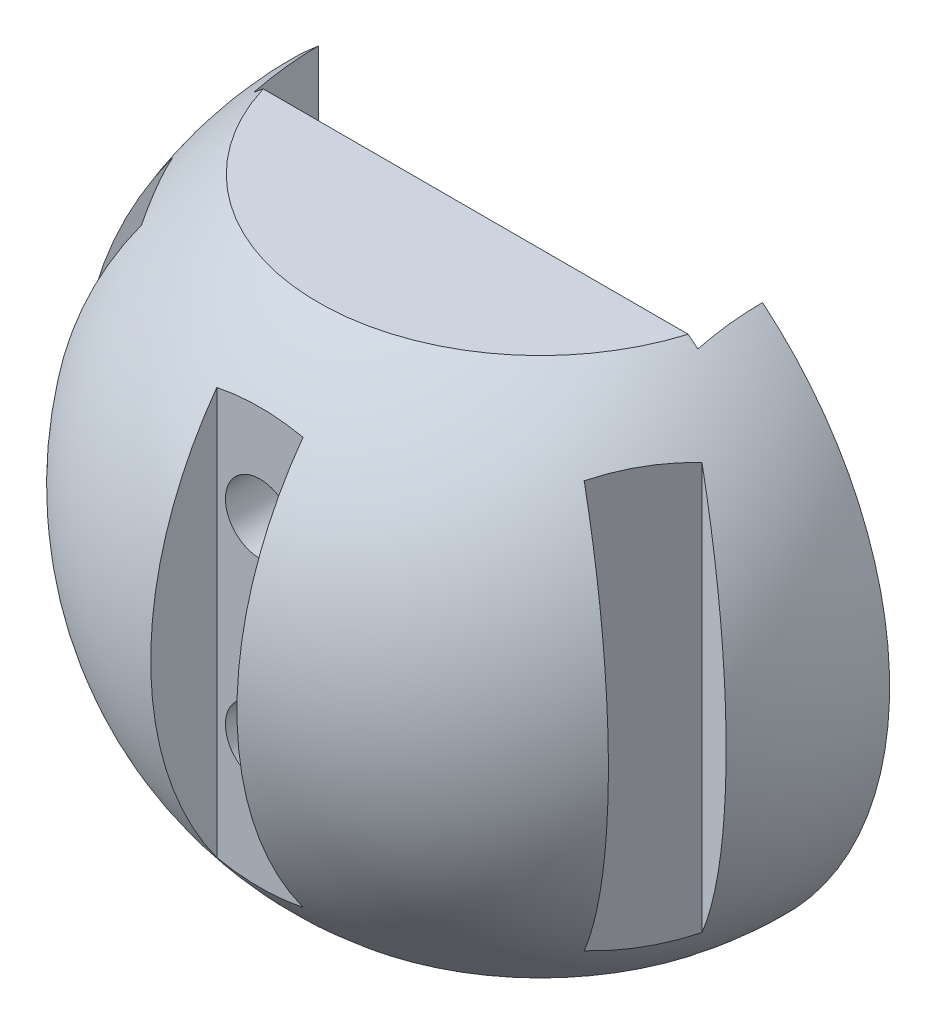
ISO-10303-21;
HEADER;
FILE_DESCRIPTION(('STEP AP214'),'2;1');
FILE_NAME('part.step','',(''),(''),'','','');
FILE_SCHEMA(('AUTOMOTIVE_DESIGN { 1 0 10303 214 1 1 1 1 }'));
ENDSEC;
DATA;
#1=APPLICATION_CONTEXT('core data for automotive mechanical design processes');
#2=APPLICATION_PROTOCOL_DEFINITION('international standard','automotive_design',2000,#1);
#3=PRODUCT_CONTEXT('',#1,'mechanical');
#4=PRODUCT('Part','Part','',(#3));
#5=PRODUCT_RELATED_PRODUCT_CATEGORY('part','',(#4));
#6=PRODUCT_DEFINITION_FORMATION('','',#4);
#7=PRODUCT_DEFINITION_CONTEXT('part definition',#1,'design');
#8=PRODUCT_DEFINITION('design','',#6,#7);
#9=PRODUCT_DEFINITION_SHAPE('','',#8);
#10=(LENGTH_UNIT() NAMED_UNIT(*) SI_UNIT(.MILLI.,.METRE.));
#11=(NAMED_UNIT(*) PLANE_ANGLE_UNIT() SI_UNIT($,.RADIAN.));
#12=(NAMED_UNIT(*) SI_UNIT($,.STERADIAN.) SOLID_ANGLE_UNIT());
#13=UNCERTAINTY_MEASURE_WITH_UNIT(LENGTH_MEASURE(1.E-05),#10,'distance_accuracy_value','');
#14=(GEOMETRIC_REPRESENTATION_CONTEXT(3) GLOBAL_UNCERTAINTY_ASSIGNED_CONTEXT((#13)) GLOBAL_UNIT_ASSIGNED_CONTEXT((#10,
#11,#12)) REPRESENTATION_CONTEXT('',''));
#15=CARTESIAN_POINT('',(0.,0.,0.));
#16=DIRECTION('',(0.,0.,1.));
#17=DIRECTION('',(1.,0.,0.));
#18=AXIS2_PLACEMENT_3D('',#15,#16,#17);
#19=CARTESIAN_POINT('',(0.,8.1,0.));
#20=DIRECTION('',(0.,1.,0.));
#21=DIRECTION('',(-1.,0.,0.));
#22=AXIS2_PLACEMENT_3D('',#19,#20,#21);
#23=SPHERICAL_SURFACE('',#22,16.2);
#24=CARTESIAN_POINT('',(-0.999999999999992,8.1,1.73205080756888));
#25=DIRECTION('',(0.499999999999998,0.,-0.86602540378444));
#26=DIRECTION('',(-0.86602540378444,0.,-0.499999999999998));
#27=AXIS2_PLACEMENT_3D('',#24,#25,#26);
#28=CIRCLE('',#27,16.0760691712869);
#29=CARTESIAN_POINT('',(10.2682706123791,17.5414742779712,8.23778987892746));
#30=VERTEX_POINT('',#29);
#31=CARTESIAN_POINT('',(10.2682706123791,-1.34147427797122,8.23778987892746));
#32=VERTEX_POINT('',#31);
#33=EDGE_CURVE('E138',#30,#32,#28,.T.);
#34=ORIENTED_EDGE('',*,*,#33,.F.);
#35=CARTESIAN_POINT('',(11.2682706123791,8.1,6.50573907135858));
#36=DIRECTION('',(-0.86602540378444,0.,-0.499999999999998));
#37=DIRECTION('',(-0.499999999999998,0.,0.86602540378444));
#38=AXIS2_PLACEMENT_3D('',#35,#36,#37);
#39=CIRCLE('',#38,9.65098111808287);
#40=CARTESIAN_POINT('',(12.2682706123791,17.5414742779712,4.7736882637897));
#41=VERTEX_POINT('',#40);
#42=EDGE_CURVE('E131',#30,#41,#39,.T.);
#43=ORIENTED_EDGE('',*,*,#42,.T.);
#44=CARTESIAN_POINT('',(1.,8.1,-1.73205080756888));
#45=DIRECTION('',(0.499999999999998,0.,-0.86602540378444));
#46=DIRECTION('',(-0.86602540378444,0.,-0.499999999999998));
#47=AXIS2_PLACEMENT_3D('',#44,#45,#46);
#48=CIRCLE('',#47,16.0760691712869);
#49=CARTESIAN_POINT('',(12.2682706123791,-1.34147427797122,4.7736882637897));
#50=VERTEX_POINT('',#49);
#51=EDGE_CURVE('E120',#41,#50,#48,.T.);
#52=ORIENTED_EDGE('',*,*,#51,.T.);
#53=EDGE_CURVE('E125',#50,#32,#39,.T.);
#54=ORIENTED_EDGE('',*,*,#53,.T.);
#55=EDGE_LOOP('',(#34,#43,#52,#54));
#56=FACE_BOUND('',#55,.T.);
#57=CARTESIAN_POINT('',(0.,8.1,3.));
#58=DIRECTION('',(0.,0.,1.));
#59=DIRECTION('',(1.,0.,0.));
#60=AXIS2_PLACEMENT_3D('',#57,#58,#59);
#61=CIRCLE('',#60,15.9197989937059);
#62=CARTESIAN_POINT('',(-9.85684605063265,20.6013033694142,2.99999999999993));
#63=VERTEX_POINT('',#62);
#64=CARTESIAN_POINT('',(-10.3032720077591,20.2360037052618,2.99999999999993));
#65=VERTEX_POINT('',#64);
#66=EDGE_CURVE('E185',#63,#65,#61,.T.);
#67=ORIENTED_EDGE('',*,*,#66,.T.);
#68=CARTESIAN_POINT('',(-10.3032720077591,8.1,0.));
#69=DIRECTION('',(-1.,0.,0.));
#70=DIRECTION('',(0.,0.,1.));
#71=AXIS2_PLACEMENT_3D('',#68,#69,#70);
#72=CIRCLE('',#71,12.5013033694142);
#73=CARTESIAN_POINT('',(-10.3032720077591,20.6013033694142,0.));
#74=VERTEX_POINT('',#73);
#75=EDGE_CURVE('E189',#65,#74,#72,.T.);
#76=ORIENTED_EDGE('',*,*,#75,.T.);
#77=CARTESIAN_POINT('',(0.,8.1,0.));
#78=DIRECTION('',(0.,0.,-1.));
#79=DIRECTION('',(1.,0.,0.));
#80=AXIS2_PLACEMENT_3D('',#77,#78,#79);
#81=CIRCLE('',#80,16.2);
#82=CARTESIAN_POINT('',(-10.3032720077591,-4.40130336941424,0.));
#83=VERTEX_POINT('',#82);
#84=EDGE_CURVE('E203',#83,#74,#81,.T.);
#85=ORIENTED_EDGE('',*,*,#84,.F.);
#86=CARTESIAN_POINT('',(-10.3032720077591,-4.03600370526179,2.99999999999993));
#87=VERTEX_POINT('',#86);
#88=EDGE_CURVE('E186',#83,#87,#72,.T.);
#89=ORIENTED_EDGE('',*,*,#88,.T.);
#90=CARTESIAN_POINT('',(-9.85684605063265,-4.40130336941424,2.99999999999993));
#91=VERTEX_POINT('',#90);
#92=EDGE_CURVE('E280',#87,#91,#61,.T.);
#93=ORIENTED_EDGE('',*,*,#92,.T.);
#94=CARTESIAN_POINT('',(0.,-4.40130336941424,0.));
#95=DIRECTION('',(0.,1.,0.));
#96=DIRECTION('',(0.,0.,1.));
#97=AXIS2_PLACEMENT_3D('',#94,#95,#96);
#98=CIRCLE('',#97,10.3032720077591);
#99=CARTESIAN_POINT('',(9.85684605063262,-4.40130336941424,3.00000000000007));
#100=VERTEX_POINT('',#99);
#101=EDGE_CURVE('E194',#91,#100,#98,.T.);
#102=ORIENTED_EDGE('',*,*,#101,.T.);
#103=CARTESIAN_POINT('',(10.3032720077591,-4.03600370526179,3.00000000000007));
#104=VERTEX_POINT('',#103);
#105=EDGE_CURVE('E179',#100,#104,#61,.T.);
#106=ORIENTED_EDGE('',*,*,#105,.T.);
#107=CARTESIAN_POINT('',(10.3032720077591,8.1,0.));
#108=DIRECTION('',(1.,0.,0.));
#109=DIRECTION('',(0.,0.,-1.));
#110=AXIS2_PLACEMENT_3D('',#107,#108,#109);
#111=CIRCLE('',#110,12.5013033694142);
#112=CARTESIAN_POINT('',(10.3032720077591,-4.40130336941424,0.));
#113=VERTEX_POINT('',#112);
#114=EDGE_CURVE('E190',#104,#113,#111,.T.);
#115=ORIENTED_EDGE('',*,*,#114,.T.);
#116=CARTESIAN_POINT('',(10.3032720077591,20.6013033694142,0.));
#117=VERTEX_POINT('',#116);
#118=EDGE_CURVE('E200',#117,#113,#81,.T.);
#119=ORIENTED_EDGE('',*,*,#118,.F.);
#120=CARTESIAN_POINT('',(10.3032720077591,20.2360037052618,3.00000000000007));
#121=VERTEX_POINT('',#120);
#122=EDGE_CURVE('E193',#117,#121,#111,.T.);
#123=ORIENTED_EDGE('',*,*,#122,.T.);
#124=CARTESIAN_POINT('',(9.85684605063261,20.6013033694142,3.00000000000007));
#125=VERTEX_POINT('',#124);
#126=EDGE_CURVE('E184',#121,#125,#61,.T.);
#127=ORIENTED_EDGE('',*,*,#126,.T.);
#128=CARTESIAN_POINT('',(0.,20.6013033694142,0.));
#129=DIRECTION('',(0.,-1.,0.));
#130=DIRECTION('',(0.,0.,-1.));
#131=AXIS2_PLACEMENT_3D('',#128,#129,#130);
#132=CIRCLE('',#131,10.3032720077591);
#133=EDGE_CURVE('E197',#125,#63,#132,.T.);
#134=ORIENTED_EDGE('',*,*,#133,.T.);
#135=EDGE_LOOP('',(#67,#76,#85,#89,#93,#102,#106,#115,#119,#123,#127,#134));
#136=FACE_BOUND('',#135,.T.);
#137=CARTESIAN_POINT('',(-2.,8.1,0.));
#138=DIRECTION('',(1.,0.,0.));
#139=DIRECTION('',(0.,0.,-1.));
#140=AXIS2_PLACEMENT_3D('',#137,#138,#139);
#141=CIRCLE('',#140,16.0760691712869);
#142=CARTESIAN_POINT('',(-2.,17.5414742779712,13.0114781427172));
#143=VERTEX_POINT('',#142);
#144=CARTESIAN_POINT('',(-2.,-1.34147427797122,13.0114781427172));
#145=VERTEX_POINT('',#144);
#146=EDGE_CURVE('E126',#143,#145,#141,.T.);
#147=ORIENTED_EDGE('',*,*,#146,.F.);
#148=CARTESIAN_POINT('',(0.,8.1,13.0114781427172));
#149=DIRECTION('',(0.,0.,-1.));
#150=DIRECTION('',(-1.,0.,0.));
#151=AXIS2_PLACEMENT_3D('',#148,#149,#150);
#152=CIRCLE('',#151,9.65098111808287);
#153=CARTESIAN_POINT('',(2.,17.5414742779712,13.0114781427172));
#154=VERTEX_POINT('',#153);
#155=EDGE_CURVE('E212',#143,#154,#152,.T.);
#156=ORIENTED_EDGE('',*,*,#155,.T.);
#157=CARTESIAN_POINT('',(2.,8.1,0.));
#158=DIRECTION('',(1.,0.,0.));
#159=DIRECTION('',(0.,0.,-1.));
#160=AXIS2_PLACEMENT_3D('',#157,#158,#159);
#161=CIRCLE('',#160,16.0760691712869);
#162=CARTESIAN_POINT('',(2.,-1.34147427797122,13.0114781427172));
#163=VERTEX_POINT('',#162);
#164=EDGE_CURVE('E207',#154,#163,#161,.T.);
#165=ORIENTED_EDGE('',*,*,#164,.T.);
#166=EDGE_CURVE('E210',#163,#145,#152,.T.);
#167=ORIENTED_EDGE('',*,*,#166,.T.);
#168=EDGE_LOOP('',(#147,#156,#165,#167));
#169=FACE_BOUND('',#168,.T.);
#170=CARTESIAN_POINT('',(-1.00000000000002,8.1,-1.73205080756887));
#171=DIRECTION('',(0.50000000000001,0.,0.866025403784433));
#172=DIRECTION('',(0.866025403784433,0.,-0.50000000000001));
#173=AXIS2_PLACEMENT_3D('',#170,#171,#172);
#174=CIRCLE('',#173,16.0760691712869);
#175=CARTESIAN_POINT('',(-12.268270612379,17.5414742779712,4.77368826378988));
#176=VERTEX_POINT('',#175);
#177=CARTESIAN_POINT('',(-12.268270612379,-1.34147427797121,4.77368826378988));
#178=VERTEX_POINT('',#177);
#179=EDGE_CURVE('E11',#176,#178,#174,.T.);
#180=ORIENTED_EDGE('',*,*,#179,.F.);
#181=CARTESIAN_POINT('',(-11.268270612379,8.1,6.50573907135874));
#182=DIRECTION('',(0.866025403784433,0.,-0.50000000000001));
#183=DIRECTION('',(-0.50000000000001,0.,-0.866025403784433));
#184=AXIS2_PLACEMENT_3D('',#181,#182,#183);
#185=CIRCLE('',#184,9.65098111808286);
#186=CARTESIAN_POINT('',(-10.268270612379,17.5414742779712,8.23778987892761));
#187=VERTEX_POINT('',#186);
#188=EDGE_CURVE('E42',#176,#187,#185,.T.);
#189=ORIENTED_EDGE('',*,*,#188,.T.);
#190=CARTESIAN_POINT('',(1.00000000000002,8.1,1.73205080756886));
#191=DIRECTION('',(0.50000000000001,0.,0.866025403784433));
#192=DIRECTION('',(0.866025403784433,0.,-0.50000000000001));
#193=AXIS2_PLACEMENT_3D('',#190,#191,#192);
#194=CIRCLE('',#193,16.0760691712869);
#195=CARTESIAN_POINT('',(-10.268270612379,-1.34147427797121,8.23778987892761));
#196=VERTEX_POINT('',#195);
#197=EDGE_CURVE('E140',#187,#196,#194,.T.);
#198=ORIENTED_EDGE('',*,*,#197,.T.);
#199=EDGE_CURVE('E145',#196,#178,#185,.T.);
#200=ORIENTED_EDGE('',*,*,#199,.T.);
#201=EDGE_LOOP('',(#180,#189,#198,#200));
#202=FACE_BOUND('',#201,.T.);
#203=ADVANCED_FACE('F35',(#56,#136,#169,#202),#23,.T.);
#204=CARTESIAN_POINT('',(0.,8.1,0.));
#205=DIRECTION('',(0.,0.,1.));
#206=DIRECTION('',(1.,0.,0.));
#207=AXIS2_PLACEMENT_3D('',#204,#205,#206);
#208=PLANE('',#207);
#209=ORIENTED_EDGE('',*,*,#118,.T.);
#210=DIRECTION('',(0.,-1.,0.));
#211=VECTOR('',#210,1.);
#212=CARTESIAN_POINT('',(10.3032720077591,20.6013033694142,0.));
#213=LINE('',#212,#211);
#214=EDGE_CURVE('E167',#117,#113,#213,.T.);
#215=ORIENTED_EDGE('',*,*,#214,.F.);
#216=EDGE_LOOP('',(#209,#215));
#217=FACE_BOUND('',#216,.T.);
#218=ADVANCED_FACE('F236',(#217),#208,.F.);
#219=ORIENTED_EDGE('',*,*,#84,.T.);
#220=DIRECTION('',(0.,1.,0.));
#221=VECTOR('',#220,1.);
#222=CARTESIAN_POINT('',(-10.3032720077591,20.6013033694142,0.));
#223=LINE('',#222,#221);
#224=EDGE_CURVE('E174',#83,#74,#223,.T.);
#225=ORIENTED_EDGE('',*,*,#224,.F.);
#226=EDGE_LOOP('',(#219,#225));
#227=FACE_BOUND('',#226,.T.);
#228=ADVANCED_FACE('F240',(#227),#208,.F.);
#229=CARTESIAN_POINT('',(10.303272007759,-4.40130336941424,16.2000000000002));
#230=DIRECTION('',(0.,1.,0.));
#231=DIRECTION('',(0.,0.,1.));
#232=AXIS2_PLACEMENT_3D('',#229,#230,#231);
#233=PLANE('',#232);
#234=ORIENTED_EDGE('',*,*,#101,.F.);
#235=DIRECTION('',(-1.,0.,0.));
#236=VECTOR('',#235,1.);
#237=CARTESIAN_POINT('',(-10.3032720077591,-4.40130336941424,2.99999999999993));
#238=LINE('',#237,#236);
#239=EDGE_CURVE('E173',#100,#91,#238,.T.);
#240=ORIENTED_EDGE('',*,*,#239,.F.);
#241=EDGE_LOOP('',(#234,#240));
#242=FACE_BOUND('',#241,.T.);
#243=ADVANCED_FACE('F245',(#242),#233,.F.);
#244=CARTESIAN_POINT('',(10.303272007759,20.6013033694142,16.2000000000002));
#245=DIRECTION('',(0.,-1.,0.));
#246=DIRECTION('',(0.,0.,-1.));
#247=AXIS2_PLACEMENT_3D('',#244,#245,#246);
#248=PLANE('',#247);
#249=ORIENTED_EDGE('',*,*,#133,.F.);
#250=DIRECTION('',(-1.,0.,0.));
#251=VECTOR('',#250,1.);
#252=CARTESIAN_POINT('',(10.3032720077591,20.6013033694142,3.00000000000007));
#253=LINE('',#252,#251);
#254=EDGE_CURVE('E204',#125,#63,#253,.T.);
#255=ORIENTED_EDGE('',*,*,#254,.T.);
#256=EDGE_LOOP('',(#249,#255));
#257=FACE_BOUND('',#256,.T.);
#258=ADVANCED_FACE('F250',(#257),#248,.F.);
#259=CARTESIAN_POINT('',(10.3032720077591,20.6013033694142,3.00000000000007));
#260=DIRECTION('',(1.,0.,0.));
#261=DIRECTION('',(0.,0.,-1.));
#262=AXIS2_PLACEMENT_3D('',#259,#260,#261);
#263=PLANE('',#262);
#264=ORIENTED_EDGE('',*,*,#214,.T.);
#265=ORIENTED_EDGE('',*,*,#114,.F.);
#266=DIRECTION('',(0.,-1.,0.));
#267=VECTOR('',#266,1.);
#268=CARTESIAN_POINT('',(10.3032720077591,20.6013033694142,3.00000000000007));
#269=LINE('',#268,#267);
#270=EDGE_CURVE('E170',#121,#104,#269,.T.);
#271=ORIENTED_EDGE('',*,*,#270,.F.);
#272=ORIENTED_EDGE('',*,*,#122,.F.);
#273=EDGE_LOOP('',(#264,#265,#271,#272));
#274=FACE_BOUND('',#273,.T.);
#275=ADVANCED_FACE('F254',(#274),#263,.F.);
#276=CARTESIAN_POINT('',(-10.3032720077591,20.6013033694142,2.99999999999993));
#277=DIRECTION('',(-1.,0.,0.));
#278=DIRECTION('',(0.,0.,1.));
#279=AXIS2_PLACEMENT_3D('',#276,#277,#278);
#280=PLANE('',#279);
#281=DIRECTION('',(0.,1.,0.));
#282=VECTOR('',#281,1.);
#283=CARTESIAN_POINT('',(-10.3032720077591,20.6013033694142,2.99999999999993));
#284=LINE('',#283,#282);
#285=EDGE_CURVE('E176',#87,#65,#284,.T.);
#286=ORIENTED_EDGE('',*,*,#285,.F.);
#287=ORIENTED_EDGE('',*,*,#88,.F.);
#288=ORIENTED_EDGE('',*,*,#224,.T.);
#289=ORIENTED_EDGE('',*,*,#75,.F.);
#290=EDGE_LOOP('',(#286,#287,#288,#289));
#291=FACE_BOUND('',#290,.T.);
#292=ADVANCED_FACE('F258',(#291),#280,.F.);
#293=CARTESIAN_POINT('',(0.,0.,3.));
#294=DIRECTION('',(0.,0.,1.));
#295=DIRECTION('',(1.,0.,0.));
#296=AXIS2_PLACEMENT_3D('',#293,#294,#295);
#297=PLANE('',#296);
#298=CARTESIAN_POINT('',(0.,13.2675786142792,3.));
#299=DIRECTION('',(0.,0.,1.));
#300=DIRECTION('',(1.,0.,0.));
#301=AXIS2_PLACEMENT_3D('',#298,#299,#300);
#302=CIRCLE('',#301,1.6);
#303=CARTESIAN_POINT('',(1.60000000000001,13.2675786142792,3.00000000000001));
#304=VERTEX_POINT('',#303);
#305=EDGE_CURVE('E157',#304,#304,#302,.T.);
#306=ORIENTED_EDGE('',*,*,#305,.T.);
#307=EDGE_LOOP('',(#306));
#308=FACE_BOUND('',#307,.T.);
#309=CARTESIAN_POINT('',(0.,4.21540642099021,3.));
#310=DIRECTION('',(0.,0.,1.));
#311=DIRECTION('',(1.,0.,0.));
#312=AXIS2_PLACEMENT_3D('',#309,#310,#311);
#313=CIRCLE('',#312,1.6);
#314=CARTESIAN_POINT('',(1.60000000000001,4.21540642099021,3.00000000000001));
#315=VERTEX_POINT('',#314);
#316=EDGE_CURVE('E273',#315,#315,#313,.T.);
#317=ORIENTED_EDGE('',*,*,#316,.T.);
#318=EDGE_LOOP('',(#317));
#319=FACE_BOUND('',#318,.T.);
#320=ORIENTED_EDGE('',*,*,#254,.F.);
#321=ORIENTED_EDGE('',*,*,#126,.F.);
#322=ORIENTED_EDGE('',*,*,#270,.T.);
#323=ORIENTED_EDGE('',*,*,#105,.F.);
#324=ORIENTED_EDGE('',*,*,#239,.T.);
#325=ORIENTED_EDGE('',*,*,#92,.F.);
#326=ORIENTED_EDGE('',*,*,#285,.T.);
#327=ORIENTED_EDGE('',*,*,#66,.F.);
#328=EDGE_LOOP('',(#320,#321,#322,#323,#324,#325,#326,#327));
#329=FACE_BOUND('',#328,.T.);
#330=ADVANCED_FACE('F231',(#308,#319,#329),#297,.F.);
#331=CARTESIAN_POINT('',(-2.,20.6013033694142,13.0114781427172));
#332=DIRECTION('',(0.,0.,-1.));
#333=DIRECTION('',(-1.,0.,0.));
#334=AXIS2_PLACEMENT_3D('',#331,#332,#333);
#335=PLANE('',#334);
#336=CARTESIAN_POINT('',(0.,13.2675786142792,13.0114781427172));
#337=DIRECTION('',(0.,0.,1.));
#338=DIRECTION('',(1.,0.,0.));
#339=AXIS2_PLACEMENT_3D('',#336,#337,#338);
#340=CIRCLE('',#339,1.6);
#341=CARTESIAN_POINT('',(1.60000000000001,13.2675786142792,13.0114781427172));
#342=VERTEX_POINT('',#341);
#343=EDGE_CURVE('E291',#342,#342,#340,.T.);
#344=ORIENTED_EDGE('',*,*,#343,.F.);
#345=EDGE_LOOP('',(#344));
#346=FACE_BOUND('',#345,.T.);
#347=CARTESIAN_POINT('',(0.,4.21540642099021,13.0114781427172));
#348=DIRECTION('',(0.,0.,1.));
#349=DIRECTION('',(1.,0.,0.));
#350=AXIS2_PLACEMENT_3D('',#347,#348,#349);
#351=CIRCLE('',#350,1.6);
#352=CARTESIAN_POINT('',(1.60000000000001,4.21540642099021,13.0114781427172));
#353=VERTEX_POINT('',#352);
#354=EDGE_CURVE('E293',#353,#353,#351,.T.);
#355=ORIENTED_EDGE('',*,*,#354,.F.);
#356=EDGE_LOOP('',(#355));
#357=FACE_BOUND('',#356,.T.);
#358=DIRECTION('',(0.,1.,0.));
#359=VECTOR('',#358,1.);
#360=CARTESIAN_POINT('',(-2.,20.6013033694142,13.0114781427172));
#361=LINE('',#360,#359);
#362=EDGE_CURVE('E164',#145,#143,#361,.T.);
#363=ORIENTED_EDGE('',*,*,#362,.F.);
#364=ORIENTED_EDGE('',*,*,#166,.F.);
#365=DIRECTION('',(0.,1.,0.));
#366=VECTOR('',#365,1.);
#367=CARTESIAN_POINT('',(2.,20.6013033694142,13.0114781427172));
#368=LINE('',#367,#366);
#369=EDGE_CURVE('E162',#163,#154,#368,.T.);
#370=ORIENTED_EDGE('',*,*,#369,.T.);
#371=ORIENTED_EDGE('',*,*,#155,.F.);
#372=EDGE_LOOP('',(#363,#364,#370,#371));
#373=FACE_BOUND('',#372,.T.);
#374=ADVANCED_FACE('F219',(#346,#357,#373),#335,.F.);
#375=CARTESIAN_POINT('',(-2.,0.,0.));
#376=DIRECTION('',(1.,0.,0.));
#377=DIRECTION('',(0.,0.,-1.));
#378=AXIS2_PLACEMENT_3D('',#375,#376,#377);
#379=PLANE('',#378);
#380=ORIENTED_EDGE('',*,*,#146,.T.);
#381=ORIENTED_EDGE('',*,*,#362,.T.);
#382=EDGE_LOOP('',(#380,#381));
#383=FACE_BOUND('',#382,.T.);
#384=ADVANCED_FACE('F221',(#383),#379,.T.);
#385=CARTESIAN_POINT('',(2.,0.,0.));
#386=DIRECTION('',(1.,0.,0.));
#387=DIRECTION('',(0.,0.,-1.));
#388=AXIS2_PLACEMENT_3D('',#385,#386,#387);
#389=PLANE('',#388);
#390=ORIENTED_EDGE('',*,*,#369,.F.);
#391=ORIENTED_EDGE('',*,*,#164,.F.);
#392=EDGE_LOOP('',(#390,#391));
#393=FACE_BOUND('',#392,.T.);
#394=ADVANCED_FACE('F223',(#393),#389,.F.);
#395=CARTESIAN_POINT('',(10.2682706123791,20.6013033694142,8.23778987892746));
#396=DIRECTION('',(-0.86602540378444,0.,-0.499999999999998));
#397=DIRECTION('',(-0.499999999999998,0.,0.86602540378444));
#398=AXIS2_PLACEMENT_3D('',#395,#396,#397);
#399=PLANE('',#398);
#400=DIRECTION('',(0.,1.,0.));
#401=VECTOR('',#400,1.);
#402=CARTESIAN_POINT('',(10.2682706123791,20.6013033694142,8.23778987892746));
#403=LINE('',#402,#401);
#404=EDGE_CURVE('E133',#32,#30,#403,.T.);
#405=ORIENTED_EDGE('',*,*,#404,.F.);
#406=ORIENTED_EDGE('',*,*,#53,.F.);
#407=DIRECTION('',(0.,1.,0.));
#408=VECTOR('',#407,1.);
#409=CARTESIAN_POINT('',(12.2682706123791,20.6013033694142,4.7736882637897));
#410=LINE('',#409,#408);
#411=EDGE_CURVE('E55',#50,#41,#410,.T.);
#412=ORIENTED_EDGE('',*,*,#411,.T.);
#413=ORIENTED_EDGE('',*,*,#42,.F.);
#414=EDGE_LOOP('',(#405,#406,#412,#413));
#415=FACE_BOUND('',#414,.T.);
#416=ADVANCED_FACE('F130',(#415),#399,.F.);
#417=CARTESIAN_POINT('',(-0.999999999999996,0.,1.73205080756888));
#418=DIRECTION('',(0.499999999999998,0.,-0.86602540378444));
#419=DIRECTION('',(-0.86602540378444,0.,-0.499999999999998));
#420=AXIS2_PLACEMENT_3D('',#417,#418,#419);
#421=PLANE('',#420);
#422=ORIENTED_EDGE('',*,*,#33,.T.);
#423=ORIENTED_EDGE('',*,*,#404,.T.);
#424=EDGE_LOOP('',(#422,#423));
#425=FACE_BOUND('',#424,.T.);
#426=ADVANCED_FACE('F317',(#425),#421,.T.);
#427=CARTESIAN_POINT('',(0.999999999999996,0.,-1.73205080756888));
#428=DIRECTION('',(0.499999999999998,0.,-0.86602540378444));
#429=DIRECTION('',(-0.86602540378444,0.,-0.499999999999998));
#430=AXIS2_PLACEMENT_3D('',#427,#428,#429);
#431=PLANE('',#430);
#432=ORIENTED_EDGE('',*,*,#411,.F.);
#433=ORIENTED_EDGE('',*,*,#51,.F.);
#434=EDGE_LOOP('',(#432,#433));
#435=FACE_BOUND('',#434,.T.);
#436=ADVANCED_FACE('F121',(#435),#431,.F.);
#437=CARTESIAN_POINT('',(-12.268270612379,20.6013033694142,4.77368826378988));
#438=DIRECTION('',(0.866025403784433,0.,-0.50000000000001));
#439=DIRECTION('',(-0.50000000000001,0.,-0.866025403784433));
#440=AXIS2_PLACEMENT_3D('',#437,#438,#439);
#441=PLANE('',#440);
#442=DIRECTION('',(0.,1.,0.));
#443=VECTOR('',#442,1.);
#444=CARTESIAN_POINT('',(-12.268270612379,20.6013033694142,4.77368826378988));
#445=LINE('',#444,#443);
#446=EDGE_CURVE('E134',#178,#176,#445,.T.);
#447=ORIENTED_EDGE('',*,*,#446,.F.);
#448=ORIENTED_EDGE('',*,*,#199,.F.);
#449=DIRECTION('',(0.,1.,0.));
#450=VECTOR('',#449,1.);
#451=CARTESIAN_POINT('',(-10.268270612379,20.6013033694142,8.23778987892761));
#452=LINE('',#451,#450);
#453=EDGE_CURVE('E48',#196,#187,#452,.T.);
#454=ORIENTED_EDGE('',*,*,#453,.T.);
#455=ORIENTED_EDGE('',*,*,#188,.F.);
#456=EDGE_LOOP('',(#447,#448,#454,#455));
#457=FACE_BOUND('',#456,.T.);
#458=ADVANCED_FACE('F153',(#457),#441,.F.);
#459=CARTESIAN_POINT('',(-1.00000000000002,0.,-1.73205080756887));
#460=DIRECTION('',(0.50000000000001,0.,0.866025403784433));
#461=DIRECTION('',(0.866025403784433,0.,-0.50000000000001));
#462=AXIS2_PLACEMENT_3D('',#459,#460,#461);
#463=PLANE('',#462);
#464=ORIENTED_EDGE('',*,*,#179,.T.);
#465=ORIENTED_EDGE('',*,*,#446,.T.);
#466=EDGE_LOOP('',(#464,#465));
#467=FACE_BOUND('',#466,.T.);
#468=ADVANCED_FACE('F155',(#467),#463,.T.);
#469=CARTESIAN_POINT('',(1.00000000000002,0.,1.73205080756887));
#470=DIRECTION('',(0.50000000000001,0.,0.866025403784433));
#471=DIRECTION('',(0.866025403784433,0.,-0.50000000000001));
#472=AXIS2_PLACEMENT_3D('',#469,#470,#471);
#473=PLANE('',#472);
#474=ORIENTED_EDGE('',*,*,#453,.F.);
#475=ORIENTED_EDGE('',*,*,#197,.F.);
#476=EDGE_LOOP('',(#474,#475));
#477=FACE_BOUND('',#476,.T.);
#478=ADVANCED_FACE('F303',(#477),#473,.F.);
#479=CARTESIAN_POINT('',(0.,4.21540642099021,0.));
#480=DIRECTION('',(0.,0.,1.));
#481=DIRECTION('',(1.,0.,0.));
#482=AXIS2_PLACEMENT_3D('',#479,#480,#481);
#483=CYLINDRICAL_SURFACE('',#482,1.6);
#484=ORIENTED_EDGE('',*,*,#354,.T.);
#485=EDGE_LOOP('',(#484));
#486=FACE_BOUND('',#485,.T.);
#487=ORIENTED_EDGE('',*,*,#316,.F.);
#488=EDGE_LOOP('',(#487));
#489=FACE_BOUND('',#488,.T.);
#490=ADVANCED_FACE('F299',(#486,#489),#483,.F.);
#491=CARTESIAN_POINT('',(0.,13.2675786142792,0.));
#492=DIRECTION('',(0.,0.,1.));
#493=DIRECTION('',(1.,0.,0.));
#494=AXIS2_PLACEMENT_3D('',#491,#492,#493);
#495=CYLINDRICAL_SURFACE('',#494,1.6);
#496=ORIENTED_EDGE('',*,*,#343,.T.);
#497=EDGE_LOOP('',(#496));
#498=FACE_BOUND('',#497,.T.);
#499=ORIENTED_EDGE('',*,*,#305,.F.);
#500=EDGE_LOOP('',(#499));
#501=FACE_BOUND('',#500,.T.);
#502=ADVANCED_FACE('F302',(#498,#501),#495,.F.);
#503=CLOSED_SHELL('',(#203,#218,#228,#243,#258,#275,#292,#330,#374,#384,#394,#416,#426,#436,
#458,#468,#478,#490,#502));
#504=MANIFOLD_SOLID_BREP('B2',#503);
#505=ADVANCED_BREP_SHAPE_REPRESENTATION('',(#18,#504),#14);
#506=SHAPE_DEFINITION_REPRESENTATION(#9,#505);
ENDSEC;
END-ISO-10303-21;
